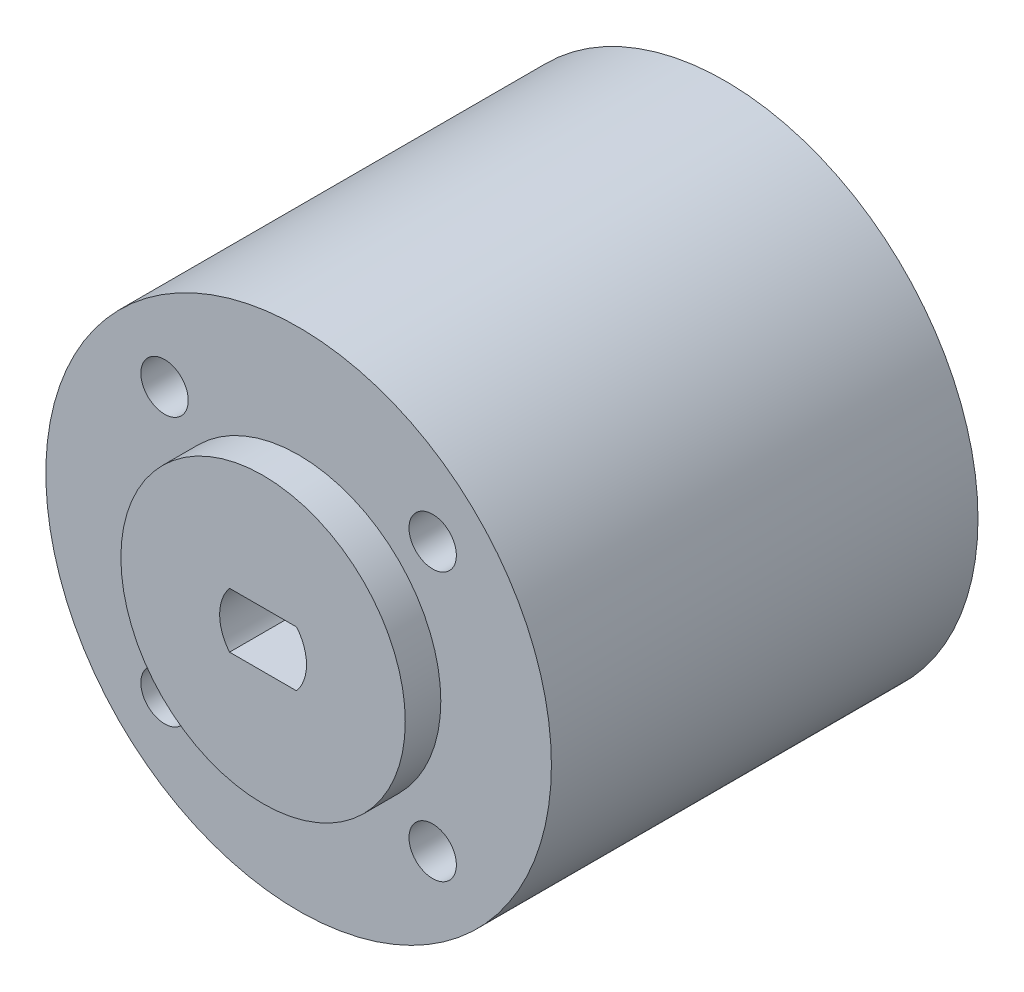
ISO-10303-21;
HEADER;
FILE_DESCRIPTION(('STEP AP214'),'2;1');
FILE_NAME('part.step','',(''),(''),'','','');
FILE_SCHEMA(('AUTOMOTIVE_DESIGN { 1 0 10303 214 1 1 1 1 }'));
ENDSEC;
DATA;
#1=APPLICATION_CONTEXT('core data for automotive mechanical design processes');
#2=APPLICATION_PROTOCOL_DEFINITION('international standard','automotive_design',2000,#1);
#3=PRODUCT_CONTEXT('',#1,'mechanical');
#4=PRODUCT('Part','Part','',(#3));
#5=PRODUCT_RELATED_PRODUCT_CATEGORY('part','',(#4));
#6=PRODUCT_DEFINITION_FORMATION('','',#4);
#7=PRODUCT_DEFINITION_CONTEXT('part definition',#1,'design');
#8=PRODUCT_DEFINITION('design','',#6,#7);
#9=PRODUCT_DEFINITION_SHAPE('','',#8);
#10=(LENGTH_UNIT() NAMED_UNIT(*) SI_UNIT(.MILLI.,.METRE.));
#11=(NAMED_UNIT(*) PLANE_ANGLE_UNIT() SI_UNIT($,.RADIAN.));
#12=(NAMED_UNIT(*) SI_UNIT($,.STERADIAN.) SOLID_ANGLE_UNIT());
#13=UNCERTAINTY_MEASURE_WITH_UNIT(LENGTH_MEASURE(1.E-05),#10,'distance_accuracy_value','');
#14=(GEOMETRIC_REPRESENTATION_CONTEXT(3) GLOBAL_UNCERTAINTY_ASSIGNED_CONTEXT((#13)) GLOBAL_UNIT_ASSIGNED_CONTEXT((#10,
#11,#12)) REPRESENTATION_CONTEXT('',''));
#15=CARTESIAN_POINT('',(0.,0.,0.));
#16=DIRECTION('',(0.,0.,1.));
#17=DIRECTION('',(1.,0.,0.));
#18=AXIS2_PLACEMENT_3D('',#15,#16,#17);
#19=CARTESIAN_POINT('',(-8.48528137423859,8.48528137423855,13.5));
#20=DIRECTION('',(0.,0.,-1.));
#21=DIRECTION('',(-1.,0.,0.));
#22=AXIS2_PLACEMENT_3D('',#19,#20,#21);
#23=CYLINDRICAL_SURFACE('',#22,1.5);
#24=CARTESIAN_POINT('',(-8.48528137423859,8.48528137423855,13.5));
#25=DIRECTION('',(0.,0.,1.));
#26=DIRECTION('',(1.,0.,0.));
#27=AXIS2_PLACEMENT_3D('',#24,#25,#26);
#28=CIRCLE('',#27,1.5);
#29=CARTESIAN_POINT('',(-6.98528137423859,8.48528137423855,13.5));
#30=VERTEX_POINT('',#29);
#31=EDGE_CURVE('E50',#30,#30,#28,.T.);
#32=ORIENTED_EDGE('',*,*,#31,.T.);
#33=EDGE_LOOP('',(#32));
#34=FACE_BOUND('',#33,.T.);
#35=CARTESIAN_POINT('',(-8.48528137423859,8.48528137423855,-13.5));
#36=DIRECTION('',(0.,0.,1.));
#37=DIRECTION('',(1.,0.,0.));
#38=AXIS2_PLACEMENT_3D('',#35,#36,#37);
#39=CIRCLE('',#38,1.5);
#40=CARTESIAN_POINT('',(-6.98528137423859,8.48528137423855,-13.5));
#41=VERTEX_POINT('',#40);
#42=EDGE_CURVE('E147',#41,#41,#39,.T.);
#43=ORIENTED_EDGE('',*,*,#42,.F.);
#44=EDGE_LOOP('',(#43));
#45=FACE_BOUND('',#44,.T.);
#46=ADVANCED_FACE('F41',(#34,#45),#23,.F.);
#47=CARTESIAN_POINT('',(8.48528137423855,8.48528137423906,13.5));
#48=DIRECTION('',(0.,0.,-1.));
#49=DIRECTION('',(-1.,0.,0.));
#50=AXIS2_PLACEMENT_3D('',#47,#48,#49);
#51=CYLINDRICAL_SURFACE('',#50,1.50000000000049);
#52=CARTESIAN_POINT('',(8.48528137423855,8.48528137423906,13.5));
#53=DIRECTION('',(0.,0.,1.));
#54=DIRECTION('',(1.,0.,0.));
#55=AXIS2_PLACEMENT_3D('',#52,#53,#54);
#56=CIRCLE('',#55,1.50000000000049);
#57=CARTESIAN_POINT('',(9.98528137423905,8.48528137423906,13.5));
#58=VERTEX_POINT('',#57);
#59=EDGE_CURVE('E135',#58,#58,#56,.T.);
#60=ORIENTED_EDGE('',*,*,#59,.T.);
#61=EDGE_LOOP('',(#60));
#62=FACE_BOUND('',#61,.T.);
#63=CARTESIAN_POINT('',(8.48528137423855,8.48528137423906,-13.5));
#64=DIRECTION('',(0.,0.,1.));
#65=DIRECTION('',(1.,0.,0.));
#66=AXIS2_PLACEMENT_3D('',#63,#64,#65);
#67=CIRCLE('',#66,1.50000000000049);
#68=CARTESIAN_POINT('',(9.98528137423905,8.48528137423906,-13.5));
#69=VERTEX_POINT('',#68);
#70=EDGE_CURVE('E145',#69,#69,#67,.T.);
#71=ORIENTED_EDGE('',*,*,#70,.F.);
#72=EDGE_LOOP('',(#71));
#73=FACE_BOUND('',#72,.T.);
#74=ADVANCED_FACE('F175',(#62,#73),#51,.F.);
#75=CARTESIAN_POINT('',(8.48528137423907,-8.48528137423807,13.5));
#76=DIRECTION('',(0.,0.,-1.));
#77=DIRECTION('',(-1.,0.,0.));
#78=AXIS2_PLACEMENT_3D('',#75,#76,#77);
#79=CYLINDRICAL_SURFACE('',#78,1.50000000000067);
#80=CARTESIAN_POINT('',(8.48528137423907,-8.48528137423807,13.5));
#81=DIRECTION('',(0.,0.,1.));
#82=DIRECTION('',(1.,0.,0.));
#83=AXIS2_PLACEMENT_3D('',#80,#81,#82);
#84=CIRCLE('',#83,1.50000000000067);
#85=CARTESIAN_POINT('',(9.98528137423974,-8.48528137423807,13.5));
#86=VERTEX_POINT('',#85);
#87=EDGE_CURVE('E132',#86,#86,#84,.T.);
#88=ORIENTED_EDGE('',*,*,#87,.T.);
#89=EDGE_LOOP('',(#88));
#90=FACE_BOUND('',#89,.T.);
#91=CARTESIAN_POINT('',(8.48528137423907,-8.48528137423807,-13.5));
#92=DIRECTION('',(0.,0.,1.));
#93=DIRECTION('',(1.,0.,0.));
#94=AXIS2_PLACEMENT_3D('',#91,#92,#93);
#95=CIRCLE('',#94,1.50000000000067);
#96=CARTESIAN_POINT('',(9.98528137423974,-8.48528137423807,-13.5));
#97=VERTEX_POINT('',#96);
#98=EDGE_CURVE('E142',#97,#97,#95,.T.);
#99=ORIENTED_EDGE('',*,*,#98,.F.);
#100=EDGE_LOOP('',(#99));
#101=FACE_BOUND('',#100,.T.);
#102=ADVANCED_FACE('F181',(#90,#101),#79,.F.);
#103=CARTESIAN_POINT('',(-8.48528137423807,-8.48528137423859,13.5));
#104=DIRECTION('',(0.,0.,-1.));
#105=DIRECTION('',(-1.,0.,0.));
#106=AXIS2_PLACEMENT_3D('',#103,#104,#105);
#107=CYLINDRICAL_SURFACE('',#106,1.50000000000025);
#108=CARTESIAN_POINT('',(-8.48528137423807,-8.48528137423859,13.5));
#109=DIRECTION('',(0.,0.,1.));
#110=DIRECTION('',(1.,0.,0.));
#111=AXIS2_PLACEMENT_3D('',#108,#109,#110);
#112=CIRCLE('',#111,1.50000000000025);
#113=CARTESIAN_POINT('',(-6.98528137423782,-8.48528137423859,13.5));
#114=VERTEX_POINT('',#113);
#115=EDGE_CURVE('E129',#114,#114,#112,.T.);
#116=ORIENTED_EDGE('',*,*,#115,.T.);
#117=EDGE_LOOP('',(#116));
#118=FACE_BOUND('',#117,.T.);
#119=CARTESIAN_POINT('',(-8.48528137423807,-8.48528137423859,-13.5));
#120=DIRECTION('',(0.,0.,1.));
#121=DIRECTION('',(1.,0.,0.));
#122=AXIS2_PLACEMENT_3D('',#119,#120,#121);
#123=CIRCLE('',#122,1.50000000000025);
#124=CARTESIAN_POINT('',(-6.98528137423782,-8.48528137423859,-13.5));
#125=VERTEX_POINT('',#124);
#126=EDGE_CURVE('E125',#125,#125,#123,.T.);
#127=ORIENTED_EDGE('',*,*,#126,.F.);
#128=EDGE_LOOP('',(#127));
#129=FACE_BOUND('',#128,.T.);
#130=ADVANCED_FACE('F43',(#118,#129),#107,.F.);
#131=CARTESIAN_POINT('',(0.,0.,13.5));
#132=DIRECTION('',(0.,0.,-1.));
#133=DIRECTION('',(-1.,0.,0.));
#134=AXIS2_PLACEMENT_3D('',#131,#132,#133);
#135=CYLINDRICAL_SURFACE('',#134,16.);
#136=CARTESIAN_POINT('',(0.,0.,13.5));
#137=DIRECTION('',(0.,0.,1.));
#138=DIRECTION('',(1.,0.,0.));
#139=AXIS2_PLACEMENT_3D('',#136,#137,#138);
#140=CIRCLE('',#139,16.);
#141=CARTESIAN_POINT('',(16.,0.,13.5));
#142=VERTEX_POINT('',#141);
#143=EDGE_CURVE('E12',#142,#142,#140,.T.);
#144=ORIENTED_EDGE('',*,*,#143,.F.);
#145=EDGE_LOOP('',(#144));
#146=FACE_BOUND('',#145,.T.);
#147=CARTESIAN_POINT('',(0.,0.,-13.5));
#148=DIRECTION('',(0.,0.,1.));
#149=DIRECTION('',(1.,0.,0.));
#150=AXIS2_PLACEMENT_3D('',#147,#148,#149);
#151=CIRCLE('',#150,16.);
#152=CARTESIAN_POINT('',(16.,0.,-13.5));
#153=VERTEX_POINT('',#152);
#154=EDGE_CURVE('E45',#153,#153,#151,.T.);
#155=ORIENTED_EDGE('',*,*,#154,.T.);
#156=EDGE_LOOP('',(#155));
#157=FACE_BOUND('',#156,.T.);
#158=ADVANCED_FACE('F154',(#146,#157),#135,.T.);
#159=CARTESIAN_POINT('',(0.,0.,13.5));
#160=DIRECTION('',(0.,0.,1.));
#161=DIRECTION('',(1.,0.,0.));
#162=AXIS2_PLACEMENT_3D('',#159,#160,#161);
#163=PLANE('',#162);
#164=CARTESIAN_POINT('',(0.,0.,13.5));
#165=DIRECTION('',(0.,0.,1.));
#166=DIRECTION('',(1.,0.,0.));
#167=AXIS2_PLACEMENT_3D('',#164,#165,#166);
#168=CIRCLE('',#167,9.);
#169=CARTESIAN_POINT('',(9.,0.,13.5));
#170=VERTEX_POINT('',#169);
#171=EDGE_CURVE('E126',#170,#170,#168,.T.);
#172=ORIENTED_EDGE('',*,*,#171,.F.);
#173=EDGE_LOOP('',(#172));
#174=FACE_BOUND('',#173,.T.);
#175=ORIENTED_EDGE('',*,*,#115,.F.);
#176=EDGE_LOOP('',(#175));
#177=FACE_BOUND('',#176,.T.);
#178=ORIENTED_EDGE('',*,*,#87,.F.);
#179=EDGE_LOOP('',(#178));
#180=FACE_BOUND('',#179,.T.);
#181=ORIENTED_EDGE('',*,*,#59,.F.);
#182=EDGE_LOOP('',(#181));
#183=FACE_BOUND('',#182,.T.);
#184=ORIENTED_EDGE('',*,*,#31,.F.);
#185=EDGE_LOOP('',(#184));
#186=FACE_BOUND('',#185,.T.);
#187=ORIENTED_EDGE('',*,*,#143,.T.);
#188=EDGE_LOOP('',(#187));
#189=FACE_BOUND('',#188,.T.);
#190=ADVANCED_FACE('F159',(#174,#177,#180,#183,#186,#189),#163,.T.);
#191=CARTESIAN_POINT('',(0.,0.,-13.5));
#192=DIRECTION('',(0.,0.,1.));
#193=DIRECTION('',(1.,0.,0.));
#194=AXIS2_PLACEMENT_3D('',#191,#192,#193);
#195=PLANE('',#194);
#196=CARTESIAN_POINT('',(0.,0.,-13.5));
#197=DIRECTION('',(0.,0.,1.));
#198=DIRECTION('',(1.,0.,0.));
#199=AXIS2_PLACEMENT_3D('',#196,#197,#198);
#200=CIRCLE('',#199,9.);
#201=CARTESIAN_POINT('',(9.,0.,-13.5));
#202=VERTEX_POINT('',#201);
#203=EDGE_CURVE('E119',#202,#202,#200,.F.);
#204=ORIENTED_EDGE('',*,*,#203,.F.);
#205=EDGE_LOOP('',(#204));
#206=FACE_BOUND('',#205,.T.);
#207=ORIENTED_EDGE('',*,*,#126,.T.);
#208=EDGE_LOOP('',(#207));
#209=FACE_BOUND('',#208,.T.);
#210=ORIENTED_EDGE('',*,*,#98,.T.);
#211=EDGE_LOOP('',(#210));
#212=FACE_BOUND('',#211,.T.);
#213=ORIENTED_EDGE('',*,*,#70,.T.);
#214=EDGE_LOOP('',(#213));
#215=FACE_BOUND('',#214,.T.);
#216=ORIENTED_EDGE('',*,*,#42,.T.);
#217=EDGE_LOOP('',(#216));
#218=FACE_BOUND('',#217,.T.);
#219=ORIENTED_EDGE('',*,*,#154,.F.);
#220=EDGE_LOOP('',(#219));
#221=FACE_BOUND('',#220,.T.);
#222=ADVANCED_FACE('F156',(#206,#209,#212,#215,#218,#221),#195,.F.);
#223=CARTESIAN_POINT('',(0.,0.,15.75));
#224=DIRECTION('',(0.,0.,-1.));
#225=DIRECTION('',(-1.,0.,0.));
#226=AXIS2_PLACEMENT_3D('',#223,#224,#225);
#227=CYLINDRICAL_SURFACE('',#226,9.);
#228=CARTESIAN_POINT('',(0.,0.,-15.75));
#229=DIRECTION('',(0.,0.,1.));
#230=DIRECTION('',(1.,0.,0.));
#231=AXIS2_PLACEMENT_3D('',#228,#229,#230);
#232=CIRCLE('',#231,9.);
#233=CARTESIAN_POINT('',(9.,0.,-15.75));
#234=VERTEX_POINT('',#233);
#235=EDGE_CURVE('E120',#234,#234,#232,.T.);
#236=ORIENTED_EDGE('',*,*,#235,.T.);
#237=EDGE_LOOP('',(#236));
#238=FACE_BOUND('',#237,.T.);
#239=ORIENTED_EDGE('',*,*,#203,.T.);
#240=EDGE_LOOP('',(#239));
#241=FACE_BOUND('',#240,.T.);
#242=ADVANCED_FACE('F158',(#238,#241),#227,.T.);
#243=CARTESIAN_POINT('',(0.,0.,15.75));
#244=DIRECTION('',(0.,0.,1.));
#245=DIRECTION('',(1.,0.,0.));
#246=AXIS2_PLACEMENT_3D('',#243,#244,#245);
#247=PLANE('',#246);
#248=CARTESIAN_POINT('',(0.,0.,15.75));
#249=DIRECTION('',(0.,0.,1.));
#250=DIRECTION('',(1.,0.,0.));
#251=AXIS2_PLACEMENT_3D('',#248,#249,#250);
#252=CIRCLE('',#251,9.);
#253=CARTESIAN_POINT('',(9.,0.,15.75));
#254=VERTEX_POINT('',#253);
#255=EDGE_CURVE('E116',#254,#254,#252,.T.);
#256=ORIENTED_EDGE('',*,*,#255,.T.);
#257=EDGE_LOOP('',(#256));
#258=FACE_BOUND('',#257,.T.);
#259=CARTESIAN_POINT('',(0.,0.,15.75));
#260=DIRECTION('',(0.,0.,1.));
#261=DIRECTION('',(1.,0.,0.));
#262=AXIS2_PLACEMENT_3D('',#259,#260,#261);
#263=CIRCLE('',#262,2.75);
#264=CARTESIAN_POINT('',(2.12132034355964,-1.75,15.75));
#265=VERTEX_POINT('',#264);
#266=CARTESIAN_POINT('',(2.12132034355964,1.75,15.75));
#267=VERTEX_POINT('',#266);
#268=EDGE_CURVE('E88',#265,#267,#263,.T.);
#269=ORIENTED_EDGE('',*,*,#268,.F.);
#270=DIRECTION('',(1.,0.,0.));
#271=VECTOR('',#270,1.);
#272=CARTESIAN_POINT('',(0.,-1.75,15.75));
#273=LINE('',#272,#271);
#274=CARTESIAN_POINT('',(-2.12132034355964,-1.75,15.75));
#275=VERTEX_POINT('',#274);
#276=EDGE_CURVE('E96',#275,#265,#273,.T.);
#277=ORIENTED_EDGE('',*,*,#276,.F.);
#278=CARTESIAN_POINT('',(-2.12132034355964,1.75,15.75));
#279=VERTEX_POINT('',#278);
#280=EDGE_CURVE('E102',#279,#275,#263,.T.);
#281=ORIENTED_EDGE('',*,*,#280,.F.);
#282=DIRECTION('',(1.,0.,0.));
#283=VECTOR('',#282,1.);
#284=CARTESIAN_POINT('',(0.,1.75,15.75));
#285=LINE('',#284,#283);
#286=EDGE_CURVE('E93',#279,#267,#285,.T.);
#287=ORIENTED_EDGE('',*,*,#286,.T.);
#288=EDGE_LOOP('',(#269,#277,#281,#287));
#289=FACE_BOUND('',#288,.T.);
#290=ADVANCED_FACE('F104',(#258,#289),#247,.T.);
#291=CARTESIAN_POINT('',(0.,0.,-15.75));
#292=DIRECTION('',(0.,0.,1.));
#293=DIRECTION('',(1.,0.,0.));
#294=AXIS2_PLACEMENT_3D('',#291,#292,#293);
#295=PLANE('',#294);
#296=ORIENTED_EDGE('',*,*,#235,.F.);
#297=EDGE_LOOP('',(#296));
#298=FACE_BOUND('',#297,.T.);
#299=DIRECTION('',(-1.,0.,0.));
#300=VECTOR('',#299,1.);
#301=CARTESIAN_POINT('',(0.,1.75,-15.75));
#302=LINE('',#301,#300);
#303=CARTESIAN_POINT('',(2.12132034355964,1.75,-15.75));
#304=VERTEX_POINT('',#303);
#305=CARTESIAN_POINT('',(-2.12132034355964,1.75,-15.75));
#306=VERTEX_POINT('',#305);
#307=EDGE_CURVE('E58',#304,#306,#302,.T.);
#308=ORIENTED_EDGE('',*,*,#307,.T.);
#309=CARTESIAN_POINT('',(0.,0.,-15.75));
#310=DIRECTION('',(0.,0.,1.));
#311=DIRECTION('',(1.,0.,0.));
#312=AXIS2_PLACEMENT_3D('',#309,#310,#311);
#313=CIRCLE('',#312,2.75);
#314=CARTESIAN_POINT('',(-2.12132034355964,-1.75,-15.75));
#315=VERTEX_POINT('',#314);
#316=EDGE_CURVE('E295',#315,#306,#313,.F.);
#317=ORIENTED_EDGE('',*,*,#316,.F.);
#318=DIRECTION('',(-1.,0.,0.));
#319=VECTOR('',#318,1.);
#320=CARTESIAN_POINT('',(0.,-1.75,-15.75));
#321=LINE('',#320,#319);
#322=CARTESIAN_POINT('',(2.12132034355964,-1.75,-15.75));
#323=VERTEX_POINT('',#322);
#324=EDGE_CURVE('E63',#323,#315,#321,.T.);
#325=ORIENTED_EDGE('',*,*,#324,.F.);
#326=CARTESIAN_POINT('',(0.,0.,-15.75));
#327=DIRECTION('',(0.,0.,1.));
#328=DIRECTION('',(1.,0.,0.));
#329=AXIS2_PLACEMENT_3D('',#326,#327,#328);
#330=CIRCLE('',#329,2.75);
#331=EDGE_CURVE('E90',#304,#323,#330,.F.);
#332=ORIENTED_EDGE('',*,*,#331,.F.);
#333=EDGE_LOOP('',(#308,#317,#325,#332));
#334=FACE_BOUND('',#333,.T.);
#335=ADVANCED_FACE('F236',(#298,#334),#295,.F.);
#336=ORIENTED_EDGE('',*,*,#171,.T.);
#337=EDGE_LOOP('',(#336));
#338=FACE_BOUND('',#337,.T.);
#339=ORIENTED_EDGE('',*,*,#255,.F.);
#340=EDGE_LOOP('',(#339));
#341=FACE_BOUND('',#340,.T.);
#342=ADVANCED_FACE('F168',(#338,#341),#227,.T.);
#343=CARTESIAN_POINT('',(0.,-1.75,-36.9632034355964));
#344=DIRECTION('',(0.,-1.,0.));
#345=DIRECTION('',(1.,0.,0.));
#346=AXIS2_PLACEMENT_3D('',#343,#344,#345);
#347=PLANE('',#346);
#348=DIRECTION('',(0.,0.,1.));
#349=VECTOR('',#348,1.);
#350=CARTESIAN_POINT('',(2.12132034355964,-1.75,-36.9632034355964));
#351=LINE('',#350,#349);
#352=EDGE_CURVE('E83',#323,#265,#351,.T.);
#353=ORIENTED_EDGE('',*,*,#352,.F.);
#354=ORIENTED_EDGE('',*,*,#324,.T.);
#355=DIRECTION('',(0.,0.,1.));
#356=VECTOR('',#355,1.);
#357=CARTESIAN_POINT('',(-2.12132034355964,-1.75,-36.9632034355964));
#358=LINE('',#357,#356);
#359=EDGE_CURVE('E92',#315,#275,#358,.T.);
#360=ORIENTED_EDGE('',*,*,#359,.T.);
#361=ORIENTED_EDGE('',*,*,#276,.T.);
#362=EDGE_LOOP('',(#353,#354,#360,#361));
#363=FACE_BOUND('',#362,.T.);
#364=ADVANCED_FACE('F97',(#363),#347,.F.);
#365=CARTESIAN_POINT('',(0.,0.,-36.9632034355964));
#366=DIRECTION('',(0.,0.,1.));
#367=DIRECTION('',(1.,0.,0.));
#368=AXIS2_PLACEMENT_3D('',#365,#366,#367);
#369=CYLINDRICAL_SURFACE('',#368,2.75);
#370=ORIENTED_EDGE('',*,*,#359,.F.);
#371=ORIENTED_EDGE('',*,*,#316,.T.);
#372=DIRECTION('',(0.,0.,1.));
#373=VECTOR('',#372,1.);
#374=CARTESIAN_POINT('',(-2.12132034355964,1.75,-36.9632034355964));
#375=LINE('',#374,#373);
#376=EDGE_CURVE('E113',#306,#279,#375,.T.);
#377=ORIENTED_EDGE('',*,*,#376,.T.);
#378=ORIENTED_EDGE('',*,*,#280,.T.);
#379=EDGE_LOOP('',(#370,#371,#377,#378));
#380=FACE_BOUND('',#379,.T.);
#381=ADVANCED_FACE('F265',(#380),#369,.F.);
#382=CARTESIAN_POINT('',(0.,1.75,-36.9632034355964));
#383=DIRECTION('',(0.,-1.,0.));
#384=DIRECTION('',(1.,0.,0.));
#385=AXIS2_PLACEMENT_3D('',#382,#383,#384);
#386=PLANE('',#385);
#387=ORIENTED_EDGE('',*,*,#307,.F.);
#388=DIRECTION('',(0.,0.,1.));
#389=VECTOR('',#388,1.);
#390=CARTESIAN_POINT('',(2.12132034355964,1.75,-36.9632034355964));
#391=LINE('',#390,#389);
#392=EDGE_CURVE('E111',#304,#267,#391,.T.);
#393=ORIENTED_EDGE('',*,*,#392,.T.);
#394=ORIENTED_EDGE('',*,*,#286,.F.);
#395=ORIENTED_EDGE('',*,*,#376,.F.);
#396=EDGE_LOOP('',(#387,#393,#394,#395));
#397=FACE_BOUND('',#396,.T.);
#398=ADVANCED_FACE('F274',(#397),#386,.T.);
#399=ORIENTED_EDGE('',*,*,#392,.F.);
#400=ORIENTED_EDGE('',*,*,#331,.T.);
#401=ORIENTED_EDGE('',*,*,#352,.T.);
#402=ORIENTED_EDGE('',*,*,#268,.T.);
#403=EDGE_LOOP('',(#399,#400,#401,#402));
#404=FACE_BOUND('',#403,.T.);
#405=ADVANCED_FACE('F86',(#404),#369,.F.);
#406=CLOSED_SHELL('',(#46,#74,#102,#130,#158,#190,#222,#242,#290,#335,#342,#364,#381,#398,#405));
#407=MANIFOLD_SOLID_BREP('B2',#406);
#408=ADVANCED_BREP_SHAPE_REPRESENTATION('',(#18,#407),#14);
#409=SHAPE_DEFINITION_REPRESENTATION(#9,#408);
ENDSEC;
END-ISO-10303-21;
